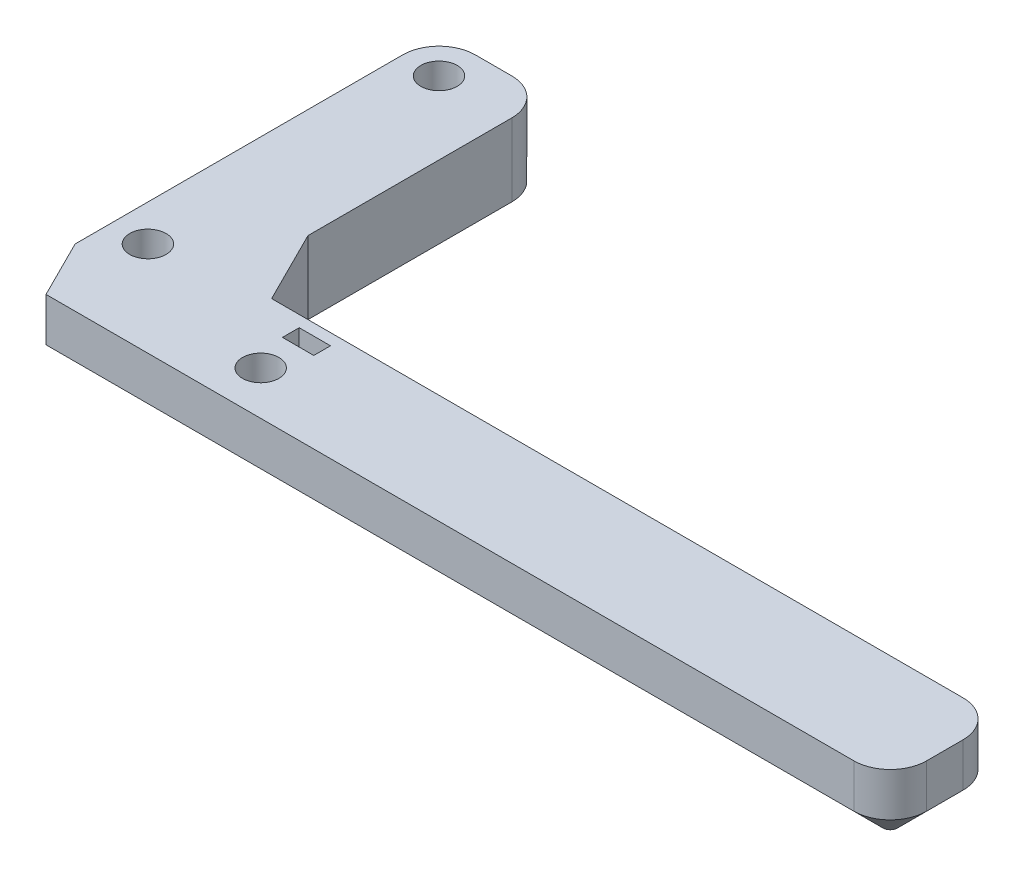
ISO-10303-21;
HEADER;
FILE_DESCRIPTION(('STEP AP214'),'2;1');
FILE_NAME('part.step','',(''),(''),'','','');
FILE_SCHEMA(('AUTOMOTIVE_DESIGN { 1 0 10303 214 1 1 1 1 }'));
ENDSEC;
DATA;
#1=APPLICATION_CONTEXT('core data for automotive mechanical design processes');
#2=APPLICATION_PROTOCOL_DEFINITION('international standard','automotive_design',2000,#1);
#3=PRODUCT_CONTEXT('',#1,'mechanical');
#4=PRODUCT('Part','Part','',(#3));
#5=PRODUCT_RELATED_PRODUCT_CATEGORY('part','',(#4));
#6=PRODUCT_DEFINITION_FORMATION('','',#4);
#7=PRODUCT_DEFINITION_CONTEXT('part definition',#1,'design');
#8=PRODUCT_DEFINITION('design','',#6,#7);
#9=PRODUCT_DEFINITION_SHAPE('','',#8);
#10=(LENGTH_UNIT() NAMED_UNIT(*) SI_UNIT(.MILLI.,.METRE.));
#11=(NAMED_UNIT(*) PLANE_ANGLE_UNIT() SI_UNIT($,.RADIAN.));
#12=(NAMED_UNIT(*) SI_UNIT($,.STERADIAN.) SOLID_ANGLE_UNIT());
#13=UNCERTAINTY_MEASURE_WITH_UNIT(LENGTH_MEASURE(1.E-05),#10,'distance_accuracy_value','');
#14=(GEOMETRIC_REPRESENTATION_CONTEXT(3) GLOBAL_UNCERTAINTY_ASSIGNED_CONTEXT((#13)) GLOBAL_UNIT_ASSIGNED_CONTEXT((#10,
#11,#12)) REPRESENTATION_CONTEXT('',''));
#15=CARTESIAN_POINT('',(0.,0.,0.));
#16=DIRECTION('',(0.,0.,1.));
#17=DIRECTION('',(1.,0.,0.));
#18=AXIS2_PLACEMENT_3D('',#15,#16,#17);
#19=CARTESIAN_POINT('',(0.,0.,0.));
#20=DIRECTION('',(0.,1.,0.));
#21=DIRECTION('',(0.,0.,1.));
#22=AXIS2_PLACEMENT_3D('',#19,#20,#21);
#23=PLANE('',#22);
#24=DIRECTION('',(-1.,0.,0.));
#25=VECTOR('',#24,1.);
#26=CARTESIAN_POINT('',(0.,0.,29.));
#27=LINE('',#26,#25);
#28=CARTESIAN_POINT('',(115.,0.,29.));
#29=VERTEX_POINT('',#28);
#30=CARTESIAN_POINT('',(29.,0.,29.));
#31=VERTEX_POINT('',#30);
#32=EDGE_CURVE('E457',#29,#31,#27,.T.);
#33=ORIENTED_EDGE('',*,*,#32,.T.);
#34=CARTESIAN_POINT('',(27.5,0.,27.));
#35=DIRECTION('',(0.,-1.,0.));
#36=DIRECTION('',(0.,0.,-1.));
#37=AXIS2_PLACEMENT_3D('',#34,#35,#36);
#38=CIRCLE('',#37,2.5);
#39=CARTESIAN_POINT('',(26.,0.,29.));
#40=VERTEX_POINT('',#39);
#41=EDGE_CURVE('E61',#40,#31,#38,.T.);
#42=ORIENTED_EDGE('',*,*,#41,.F.);
#43=CARTESIAN_POINT('',(14.,0.,29.));
#44=VERTEX_POINT('',#43);
#45=EDGE_CURVE('E456',#40,#44,#27,.T.);
#46=ORIENTED_EDGE('',*,*,#45,.T.);
#47=DIRECTION('',(0.,0.,1.));
#48=VECTOR('',#47,1.);
#49=CARTESIAN_POINT('',(14.,0.,-25.));
#50=LINE('',#49,#48);
#51=CARTESIAN_POINT('',(14.,0.,-23.));
#52=VERTEX_POINT('',#51);
#53=EDGE_CURVE('E488',#52,#44,#50,.T.);
#54=ORIENTED_EDGE('',*,*,#53,.F.);
#55=CARTESIAN_POINT('',(9.99999999999999,0.,-20.));
#56=DIRECTION('',(0.,1.,0.));
#57=DIRECTION('',(0.,0.,1.));
#58=AXIS2_PLACEMENT_3D('',#55,#56,#57);
#59=CIRCLE('',#58,5.);
#60=CARTESIAN_POINT('',(15.,0.,-20.));
#61=VERTEX_POINT('',#60);
#62=EDGE_CURVE('E396',#52,#61,#59,.F.);
#63=ORIENTED_EDGE('',*,*,#62,.T.);
#64=DIRECTION('',(0.,0.,-1.));
#65=VECTOR('',#64,1.);
#66=CARTESIAN_POINT('',(15.,0.,-25.));
#67=LINE('',#66,#65);
#68=CARTESIAN_POINT('',(15.,0.,8.));
#69=VERTEX_POINT('',#68);
#70=EDGE_CURVE('E367',#69,#61,#67,.T.);
#71=ORIENTED_EDGE('',*,*,#70,.F.);
#72=DIRECTION('',(-0.447213595499958,0.,-0.894427190999916));
#73=VECTOR('',#72,1.);
#74=CARTESIAN_POINT('',(15.,0.,8.));
#75=LINE('',#74,#73);
#76=CARTESIAN_POINT('',(22.,0.,22.));
#77=VERTEX_POINT('',#76);
#78=EDGE_CURVE('E239',#77,#69,#75,.T.);
#79=ORIENTED_EDGE('',*,*,#78,.F.);
#80=DIRECTION('',(1.,0.,0.));
#81=VECTOR('',#80,1.);
#82=CARTESIAN_POINT('',(0.,0.,22.));
#83=LINE('',#82,#81);
#84=CARTESIAN_POINT('',(115.,0.,22.0000000000001));
#85=VERTEX_POINT('',#84);
#86=EDGE_CURVE('E444',#77,#85,#83,.T.);
#87=ORIENTED_EDGE('',*,*,#86,.T.);
#88=CARTESIAN_POINT('',(115.,0.,23.));
#89=DIRECTION('',(0.,1.,0.));
#90=DIRECTION('',(0.,0.,1.));
#91=AXIS2_PLACEMENT_3D('',#88,#89,#90);
#92=CIRCLE('',#91,0.999999999999973);
#93=CARTESIAN_POINT('',(116.,0.,23.));
#94=VERTEX_POINT('',#93);
#95=EDGE_CURVE('E447',#85,#94,#92,.F.);
#96=ORIENTED_EDGE('',*,*,#95,.T.);
#97=DIRECTION('',(0.,0.,1.));
#98=VECTOR('',#97,1.);
#99=CARTESIAN_POINT('',(116.,0.,0.));
#100=LINE('',#99,#98);
#101=CARTESIAN_POINT('',(116.,0.,28.));
#102=VERTEX_POINT('',#101);
#103=EDGE_CURVE('E450',#94,#102,#100,.T.);
#104=ORIENTED_EDGE('',*,*,#103,.T.);
#105=CARTESIAN_POINT('',(115.,0.,28.));
#106=DIRECTION('',(0.,1.,0.));
#107=DIRECTION('',(0.,0.,1.));
#108=AXIS2_PLACEMENT_3D('',#105,#106,#107);
#109=CIRCLE('',#108,0.99999999999997);
#110=EDGE_CURVE('E453',#102,#29,#109,.F.);
#111=ORIENTED_EDGE('',*,*,#110,.T.);
#112=EDGE_LOOP('',(#33,#42,#46,#54,#63,#71,#79,#87,#96,#104,#111));
#113=FACE_BOUND('',#112,.T.);
#114=ADVANCED_FACE('F46',(#113),#23,.F.);
#115=CARTESIAN_POINT('',(0.,10.,0.));
#116=DIRECTION('',(0.,1.,0.));
#117=DIRECTION('',(0.,0.,1.));
#118=AXIS2_PLACEMENT_3D('',#115,#116,#117);
#119=PLANE('',#118);
#120=CARTESIAN_POINT('',(27.5,10.,27.));
#121=DIRECTION('',(0.,-1.,0.));
#122=DIRECTION('',(0.,0.,-1.));
#123=AXIS2_PLACEMENT_3D('',#120,#121,#122);
#124=CIRCLE('',#123,2.5);
#125=CARTESIAN_POINT('',(27.5,10.,24.5));
#126=VERTEX_POINT('',#125);
#127=EDGE_CURVE('E264',#126,#126,#124,.T.);
#128=ORIENTED_EDGE('',*,*,#127,.T.);
#129=EDGE_LOOP('',(#128));
#130=FACE_BOUND('',#129,.T.);
#131=CARTESIAN_POINT('',(5.,10.,-20.));
#132=DIRECTION('',(0.,1.,0.));
#133=DIRECTION('',(0.,0.,1.));
#134=AXIS2_PLACEMENT_3D('',#131,#132,#133);
#135=CIRCLE('',#134,2.5);
#136=CARTESIAN_POINT('',(5.,10.,-17.5));
#137=VERTEX_POINT('',#136);
#138=EDGE_CURVE('E240',#137,#137,#135,.T.);
#139=ORIENTED_EDGE('',*,*,#138,.F.);
#140=EDGE_LOOP('',(#139));
#141=FACE_BOUND('',#140,.T.);
#142=DIRECTION('',(1.,0.,0.));
#143=VECTOR('',#142,1.);
#144=CARTESIAN_POINT('',(4.,10.,33.));
#145=LINE('',#144,#143);
#146=CARTESIAN_POINT('',(4.,10.,33.));
#147=VERTEX_POINT('',#146);
#148=CARTESIAN_POINT('',(115.,10.,33.));
#149=VERTEX_POINT('',#148);
#150=EDGE_CURVE('E339',#147,#149,#145,.T.);
#151=ORIENTED_EDGE('',*,*,#150,.T.);
#152=CARTESIAN_POINT('',(115.,10.,28.));
#153=DIRECTION('',(0.,1.,0.));
#154=DIRECTION('',(0.,0.,1.));
#155=AXIS2_PLACEMENT_3D('',#152,#153,#154);
#156=CIRCLE('',#155,5.);
#157=CARTESIAN_POINT('',(120.,10.,28.));
#158=VERTEX_POINT('',#157);
#159=EDGE_CURVE('E411',#149,#158,#156,.T.);
#160=ORIENTED_EDGE('',*,*,#159,.T.);
#161=DIRECTION('',(0.,0.,-1.));
#162=VECTOR('',#161,1.);
#163=CARTESIAN_POINT('',(120.,10.,33.));
#164=LINE('',#163,#162);
#165=CARTESIAN_POINT('',(120.,10.,23.));
#166=VERTEX_POINT('',#165);
#167=EDGE_CURVE('E344',#158,#166,#164,.T.);
#168=ORIENTED_EDGE('',*,*,#167,.T.);
#169=CARTESIAN_POINT('',(115.,10.,23.));
#170=DIRECTION('',(0.,1.,0.));
#171=DIRECTION('',(0.,0.,1.));
#172=AXIS2_PLACEMENT_3D('',#169,#170,#171);
#173=CIRCLE('',#172,5.);
#174=CARTESIAN_POINT('',(115.,10.,18.));
#175=VERTEX_POINT('',#174);
#176=EDGE_CURVE('E408',#166,#175,#173,.T.);
#177=ORIENTED_EDGE('',*,*,#176,.T.);
#178=DIRECTION('',(-1.,0.,0.));
#179=VECTOR('',#178,1.);
#180=CARTESIAN_POINT('',(120.,10.,18.));
#181=LINE('',#180,#179);
#182=CARTESIAN_POINT('',(20.,10.,18.));
#183=VERTEX_POINT('',#182);
#184=EDGE_CURVE('E348',#175,#183,#181,.T.);
#185=ORIENTED_EDGE('',*,*,#184,.T.);
#186=DIRECTION('',(-0.447213595499958,0.,-0.894427190999916));
#187=VECTOR('',#186,1.);
#188=CARTESIAN_POINT('',(15.,10.,8.));
#189=LINE('',#188,#187);
#190=CARTESIAN_POINT('',(15.,10.,8.));
#191=VERTEX_POINT('',#190);
#192=EDGE_CURVE('E351',#183,#191,#189,.T.);
#193=ORIENTED_EDGE('',*,*,#192,.T.);
#194=DIRECTION('',(0.,0.,-1.));
#195=VECTOR('',#194,1.);
#196=CARTESIAN_POINT('',(15.,10.,-25.));
#197=LINE('',#196,#195);
#198=CARTESIAN_POINT('',(15.,10.,-20.));
#199=VERTEX_POINT('',#198);
#200=EDGE_CURVE('E354',#191,#199,#197,.T.);
#201=ORIENTED_EDGE('',*,*,#200,.T.);
#202=CARTESIAN_POINT('',(9.99999999999999,10.,-20.));
#203=DIRECTION('',(0.,1.,0.));
#204=DIRECTION('',(0.,0.,1.));
#205=AXIS2_PLACEMENT_3D('',#202,#203,#204);
#206=CIRCLE('',#205,5.);
#207=CARTESIAN_POINT('',(9.99999999999999,10.,-25.));
#208=VERTEX_POINT('',#207);
#209=EDGE_CURVE('E402',#199,#208,#206,.T.);
#210=ORIENTED_EDGE('',*,*,#209,.T.);
#211=DIRECTION('',(-1.,0.,0.));
#212=VECTOR('',#211,1.);
#213=CARTESIAN_POINT('',(0.,10.,-25.));
#214=LINE('',#213,#212);
#215=CARTESIAN_POINT('',(4.99999999999999,10.,-25.));
#216=VERTEX_POINT('',#215);
#217=EDGE_CURVE('E358',#208,#216,#214,.T.);
#218=ORIENTED_EDGE('',*,*,#217,.T.);
#219=CARTESIAN_POINT('',(4.99999999999999,10.,-20.));
#220=DIRECTION('',(0.,1.,0.));
#221=DIRECTION('',(0.,0.,1.));
#222=AXIS2_PLACEMENT_3D('',#219,#220,#221);
#223=CIRCLE('',#222,5.);
#224=CARTESIAN_POINT('',(0.,10.,-20.));
#225=VERTEX_POINT('',#224);
#226=EDGE_CURVE('E405',#216,#225,#223,.T.);
#227=ORIENTED_EDGE('',*,*,#226,.T.);
#228=DIRECTION('',(0.,0.,1.));
#229=VECTOR('',#228,1.);
#230=CARTESIAN_POINT('',(0.,10.,25.));
#231=LINE('',#230,#229);
#232=CARTESIAN_POINT('',(0.,10.,25.));
#233=VERTEX_POINT('',#232);
#234=EDGE_CURVE('E362',#225,#233,#231,.T.);
#235=ORIENTED_EDGE('',*,*,#234,.T.);
#236=DIRECTION('',(0.447213595499958,0.,0.894427190999916));
#237=VECTOR('',#236,1.);
#238=CARTESIAN_POINT('',(0.,10.,25.));
#239=LINE('',#238,#237);
#240=EDGE_CURVE('E335',#233,#147,#239,.T.);
#241=ORIENTED_EDGE('',*,*,#240,.T.);
#242=EDGE_LOOP('',(#151,#160,#168,#177,#185,#193,#201,#210,#218,#227,#235,#241));
#243=FACE_BOUND('',#242,.T.);
#244=CARTESIAN_POINT('',(5.00000000000001,10.,20.));
#245=DIRECTION('',(0.,1.,0.));
#246=DIRECTION('',(0.,0.,1.));
#247=AXIS2_PLACEMENT_3D('',#244,#245,#246);
#248=CIRCLE('',#247,2.5);
#249=CARTESIAN_POINT('',(5.00000000000001,10.,22.5));
#250=VERTEX_POINT('',#249);
#251=EDGE_CURVE('E321',#250,#250,#248,.T.);
#252=ORIENTED_EDGE('',*,*,#251,.F.);
#253=EDGE_LOOP('',(#252));
#254=FACE_BOUND('',#253,.T.);
#255=DIRECTION('',(-1.,0.,0.));
#256=VECTOR('',#255,1.);
#257=CARTESIAN_POINT('',(29.66,10.,19.57));
#258=LINE('',#257,#256);
#259=CARTESIAN_POINT('',(29.66,10.,19.57));
#260=VERTEX_POINT('',#259);
#261=CARTESIAN_POINT('',(25.36,10.,19.57));
#262=VERTEX_POINT('',#261);
#263=EDGE_CURVE('E499',#260,#262,#258,.T.);
#264=ORIENTED_EDGE('',*,*,#263,.F.);
#265=DIRECTION('',(0.,0.,-1.));
#266=VECTOR('',#265,1.);
#267=CARTESIAN_POINT('',(29.66,10.,21.87));
#268=LINE('',#267,#266);
#269=CARTESIAN_POINT('',(29.66,10.,21.87));
#270=VERTEX_POINT('',#269);
#271=EDGE_CURVE('E285',#270,#260,#268,.T.);
#272=ORIENTED_EDGE('',*,*,#271,.F.);
#273=DIRECTION('',(1.,0.,0.));
#274=VECTOR('',#273,1.);
#275=CARTESIAN_POINT('',(25.36,10.,21.87));
#276=LINE('',#275,#274);
#277=CARTESIAN_POINT('',(25.36,10.,21.87));
#278=VERTEX_POINT('',#277);
#279=EDGE_CURVE('E304',#278,#270,#276,.T.);
#280=ORIENTED_EDGE('',*,*,#279,.F.);
#281=DIRECTION('',(0.,0.,1.));
#282=VECTOR('',#281,1.);
#283=CARTESIAN_POINT('',(25.36,10.,19.57));
#284=LINE('',#283,#282);
#285=EDGE_CURVE('E312',#262,#278,#284,.T.);
#286=ORIENTED_EDGE('',*,*,#285,.F.);
#287=EDGE_LOOP('',(#264,#272,#280,#286));
#288=FACE_BOUND('',#287,.T.);
#289=ADVANCED_FACE('F509',(#130,#141,#243,#254,#288),#119,.T.);
#290=CARTESIAN_POINT('',(5.00000000000001,0.,20.));
#291=DIRECTION('',(0.,1.,0.));
#292=DIRECTION('',(0.,0.,1.));
#293=AXIS2_PLACEMENT_3D('',#290,#291,#292);
#294=CIRCLE('',#293,2.5);
#295=CARTESIAN_POINT('',(5.00000000000001,0.,22.5));
#296=VERTEX_POINT('',#295);
#297=EDGE_CURVE('E320',#296,#296,#294,.T.);
#298=ORIENTED_EDGE('',*,*,#297,.T.);
#299=EDGE_LOOP('',(#298));
#300=FACE_BOUND('',#299,.T.);
#301=CARTESIAN_POINT('',(5.,0.,-20.));
#302=DIRECTION('',(0.,1.,0.));
#303=DIRECTION('',(0.,0.,1.));
#304=AXIS2_PLACEMENT_3D('',#301,#302,#303);
#305=CIRCLE('',#304,2.5);
#306=CARTESIAN_POINT('',(5.,0.,-17.5));
#307=VERTEX_POINT('',#306);
#308=EDGE_CURVE('E325',#307,#307,#305,.T.);
#309=ORIENTED_EDGE('',*,*,#308,.T.);
#310=EDGE_LOOP('',(#309));
#311=FACE_BOUND('',#310,.T.);
#312=DIRECTION('',(0.,0.,-1.));
#313=VECTOR('',#312,1.);
#314=CARTESIAN_POINT('',(9.99999999999999,0.,34.3956784204101));
#315=LINE('',#314,#313);
#316=CARTESIAN_POINT('',(9.99999999999999,0.,29.));
#317=VERTEX_POINT('',#316);
#318=CARTESIAN_POINT('',(10.,0.,-25.));
#319=VERTEX_POINT('',#318);
#320=EDGE_CURVE('E103',#317,#319,#315,.T.);
#321=ORIENTED_EDGE('',*,*,#320,.F.);
#322=DIRECTION('',(1.,0.,0.));
#323=VECTOR('',#322,1.);
#324=CARTESIAN_POINT('',(4.,0.,29.));
#325=LINE('',#324,#323);
#326=CARTESIAN_POINT('',(1.99999999999999,0.,29.));
#327=VERTEX_POINT('',#326);
#328=EDGE_CURVE('E217',#317,#327,#325,.F.);
#329=ORIENTED_EDGE('',*,*,#328,.T.);
#330=DIRECTION('',(0.447213595499958,0.,0.894427190999916));
#331=VECTOR('',#330,1.);
#332=CARTESIAN_POINT('',(0.,0.,25.));
#333=LINE('',#332,#331);
#334=CARTESIAN_POINT('',(0.,0.,25.));
#335=VERTEX_POINT('',#334);
#336=EDGE_CURVE('E221',#335,#327,#333,.T.);
#337=ORIENTED_EDGE('',*,*,#336,.F.);
#338=DIRECTION('',(0.,0.,1.));
#339=VECTOR('',#338,1.);
#340=CARTESIAN_POINT('',(0.,0.,25.));
#341=LINE('',#340,#339);
#342=CARTESIAN_POINT('',(0.,0.,-20.));
#343=VERTEX_POINT('',#342);
#344=EDGE_CURVE('E340',#343,#335,#341,.T.);
#345=ORIENTED_EDGE('',*,*,#344,.F.);
#346=CARTESIAN_POINT('',(4.99999999999999,0.,-20.));
#347=DIRECTION('',(0.,1.,0.));
#348=DIRECTION('',(0.,0.,1.));
#349=AXIS2_PLACEMENT_3D('',#346,#347,#348);
#350=CIRCLE('',#349,5.);
#351=CARTESIAN_POINT('',(4.99999999999999,0.,-25.));
#352=VERTEX_POINT('',#351);
#353=EDGE_CURVE('E421',#343,#352,#350,.F.);
#354=ORIENTED_EDGE('',*,*,#353,.T.);
#355=DIRECTION('',(-1.,0.,0.));
#356=VECTOR('',#355,1.);
#357=CARTESIAN_POINT('',(0.,0.,-25.));
#358=LINE('',#357,#356);
#359=EDGE_CURVE('E371',#319,#352,#358,.T.);
#360=ORIENTED_EDGE('',*,*,#359,.F.);
#361=EDGE_LOOP('',(#321,#329,#337,#345,#354,#360));
#362=FACE_BOUND('',#361,.T.);
#363=ADVANCED_FACE('F219',(#300,#311,#362),#23,.F.);
#364=CARTESIAN_POINT('',(0.,10.,25.));
#365=DIRECTION('',(0.894427190999916,0.,-0.447213595499958));
#366=DIRECTION('',(-0.447213595499958,0.,-0.894427190999916));
#367=AXIS2_PLACEMENT_3D('',#364,#365,#366);
#368=PLANE('',#367);
#369=ORIENTED_EDGE('',*,*,#336,.T.);
#370=DIRECTION('',(-0.333333333333334,-0.666666666666665,-0.666666666666668));
#371=VECTOR('',#370,1.);
#372=CARTESIAN_POINT('',(4.,4.00000000000002,33.));
#373=LINE('',#372,#371);
#374=CARTESIAN_POINT('',(4.,4.00000000000002,33.));
#375=VERTEX_POINT('',#374);
#376=EDGE_CURVE('E227',#327,#375,#373,.F.);
#377=ORIENTED_EDGE('',*,*,#376,.T.);
#378=DIRECTION('',(0.,-1.,0.));
#379=VECTOR('',#378,1.);
#380=CARTESIAN_POINT('',(4.,10.,33.));
#381=LINE('',#380,#379);
#382=EDGE_CURVE('E386',#147,#375,#381,.T.);
#383=ORIENTED_EDGE('',*,*,#382,.F.);
#384=ORIENTED_EDGE('',*,*,#240,.F.);
#385=DIRECTION('',(0.,-1.,0.));
#386=VECTOR('',#385,1.);
#387=CARTESIAN_POINT('',(0.,10.,25.));
#388=LINE('',#387,#386);
#389=EDGE_CURVE('E237',#233,#335,#388,.T.);
#390=ORIENTED_EDGE('',*,*,#389,.T.);
#391=EDGE_LOOP('',(#369,#377,#383,#384,#390));
#392=FACE_BOUND('',#391,.T.);
#393=ADVANCED_FACE('F232',(#392),#368,.F.);
#394=CARTESIAN_POINT('',(4.,10.,33.));
#395=DIRECTION('',(0.,0.,-1.));
#396=DIRECTION('',(-1.,0.,0.));
#397=AXIS2_PLACEMENT_3D('',#394,#395,#396);
#398=PLANE('',#397);
#399=ORIENTED_EDGE('',*,*,#382,.T.);
#400=DIRECTION('',(1.,0.,0.));
#401=VECTOR('',#400,1.);
#402=CARTESIAN_POINT('',(4.,4.00000000000002,33.));
#403=LINE('',#402,#401);
#404=CARTESIAN_POINT('',(115.,4.00000000000002,33.));
#405=VERTEX_POINT('',#404);
#406=EDGE_CURVE('E244',#375,#405,#403,.T.);
#407=ORIENTED_EDGE('',*,*,#406,.T.);
#408=DIRECTION('',(0.,-1.,0.));
#409=VECTOR('',#408,1.);
#410=CARTESIAN_POINT('',(115.,10.,33.));
#411=LINE('',#410,#409);
#412=EDGE_CURVE('E399',#405,#149,#411,.F.);
#413=ORIENTED_EDGE('',*,*,#412,.T.);
#414=ORIENTED_EDGE('',*,*,#150,.F.);
#415=EDGE_LOOP('',(#399,#407,#413,#414));
#416=FACE_BOUND('',#415,.T.);
#417=ADVANCED_FACE('F536',(#416),#398,.F.);
#418=CARTESIAN_POINT('',(120.,10.,33.));
#419=DIRECTION('',(-1.,0.,0.));
#420=DIRECTION('',(0.,0.,1.));
#421=AXIS2_PLACEMENT_3D('',#418,#419,#420);
#422=PLANE('',#421);
#423=DIRECTION('',(0.,-1.,0.));
#424=VECTOR('',#423,1.);
#425=CARTESIAN_POINT('',(120.,10.,28.));
#426=LINE('',#425,#424);
#427=CARTESIAN_POINT('',(120.,4.00000000000002,28.));
#428=VERTEX_POINT('',#427);
#429=EDGE_CURVE('E392',#158,#428,#426,.T.);
#430=ORIENTED_EDGE('',*,*,#429,.T.);
#431=DIRECTION('',(0.,0.,-1.));
#432=VECTOR('',#431,1.);
#433=CARTESIAN_POINT('',(120.,4.00000000000002,33.));
#434=LINE('',#433,#432);
#435=CARTESIAN_POINT('',(120.,4.00000000000002,23.));
#436=VERTEX_POINT('',#435);
#437=EDGE_CURVE('E440',#428,#436,#434,.T.);
#438=ORIENTED_EDGE('',*,*,#437,.T.);
#439=DIRECTION('',(0.,-1.,0.));
#440=VECTOR('',#439,1.);
#441=CARTESIAN_POINT('',(120.,10.,23.));
#442=LINE('',#441,#440);
#443=EDGE_CURVE('E389',#436,#166,#442,.F.);
#444=ORIENTED_EDGE('',*,*,#443,.T.);
#445=ORIENTED_EDGE('',*,*,#167,.F.);
#446=EDGE_LOOP('',(#430,#438,#444,#445));
#447=FACE_BOUND('',#446,.T.);
#448=ADVANCED_FACE('F571',(#447),#422,.F.);
#449=CARTESIAN_POINT('',(20.,10.,18.));
#450=DIRECTION('',(0.,0.,1.));
#451=DIRECTION('',(1.,0.,0.));
#452=AXIS2_PLACEMENT_3D('',#449,#450,#451);
#453=PLANE('',#452);
#454=DIRECTION('',(0.,-1.,0.));
#455=VECTOR('',#454,1.);
#456=CARTESIAN_POINT('',(115.,10.,18.));
#457=LINE('',#456,#455);
#458=CARTESIAN_POINT('',(115.,4.00000000000002,18.));
#459=VERTEX_POINT('',#458);
#460=EDGE_CURVE('E414',#175,#459,#457,.T.);
#461=ORIENTED_EDGE('',*,*,#460,.T.);
#462=DIRECTION('',(-1.,0.,0.));
#463=VECTOR('',#462,1.);
#464=CARTESIAN_POINT('',(20.,4.00000000000002,18.));
#465=LINE('',#464,#463);
#466=CARTESIAN_POINT('',(20.,4.00000000000002,18.));
#467=VERTEX_POINT('',#466);
#468=EDGE_CURVE('E70',#459,#467,#465,.T.);
#469=ORIENTED_EDGE('',*,*,#468,.T.);
#470=DIRECTION('',(0.,-1.,0.));
#471=VECTOR('',#470,1.);
#472=CARTESIAN_POINT('',(20.,10.,18.));
#473=LINE('',#472,#471);
#474=EDGE_CURVE('E383',#183,#467,#473,.T.);
#475=ORIENTED_EDGE('',*,*,#474,.F.);
#476=ORIENTED_EDGE('',*,*,#184,.F.);
#477=EDGE_LOOP('',(#461,#469,#475,#476));
#478=FACE_BOUND('',#477,.T.);
#479=ADVANCED_FACE('F591',(#478),#453,.F.);
#480=CARTESIAN_POINT('',(15.,10.,8.));
#481=DIRECTION('',(-0.894427190999916,0.,0.447213595499958));
#482=DIRECTION('',(0.447213595499958,0.,0.894427190999916));
#483=AXIS2_PLACEMENT_3D('',#480,#481,#482);
#484=PLANE('',#483);
#485=ORIENTED_EDGE('',*,*,#78,.T.);
#486=DIRECTION('',(0.,-1.,0.));
#487=VECTOR('',#486,1.);
#488=CARTESIAN_POINT('',(15.,10.,8.));
#489=LINE('',#488,#487);
#490=EDGE_CURVE('E379',#191,#69,#489,.T.);
#491=ORIENTED_EDGE('',*,*,#490,.F.);
#492=ORIENTED_EDGE('',*,*,#192,.F.);
#493=ORIENTED_EDGE('',*,*,#474,.T.);
#494=DIRECTION('',(-0.333333333333334,0.666666666666665,-0.666666666666668));
#495=VECTOR('',#494,1.);
#496=CARTESIAN_POINT('',(15.8888888888889,12.2222222222222,9.77777777777777));
#497=LINE('',#496,#495);
#498=EDGE_CURVE('E56',#467,#77,#497,.F.);
#499=ORIENTED_EDGE('',*,*,#498,.T.);
#500=EDGE_LOOP('',(#485,#491,#492,#493,#499));
#501=FACE_BOUND('',#500,.T.);
#502=ADVANCED_FACE('F596',(#501),#484,.F.);
#503=CARTESIAN_POINT('',(15.,10.,-25.));
#504=DIRECTION('',(-1.,0.,0.));
#505=DIRECTION('',(0.,0.,1.));
#506=AXIS2_PLACEMENT_3D('',#503,#504,#505);
#507=PLANE('',#506);
#508=ORIENTED_EDGE('',*,*,#70,.T.);
#509=DIRECTION('',(0.,-1.,0.));
#510=VECTOR('',#509,1.);
#511=CARTESIAN_POINT('',(15.,10.,-20.));
#512=LINE('',#511,#510);
#513=EDGE_CURVE('E437',#61,#199,#512,.F.);
#514=ORIENTED_EDGE('',*,*,#513,.T.);
#515=ORIENTED_EDGE('',*,*,#200,.F.);
#516=ORIENTED_EDGE('',*,*,#490,.T.);
#517=EDGE_LOOP('',(#508,#514,#515,#516));
#518=FACE_BOUND('',#517,.T.);
#519=ADVANCED_FACE('F775',(#518),#507,.F.);
#520=CARTESIAN_POINT('',(0.,10.,-25.));
#521=DIRECTION('',(0.,0.,1.));
#522=DIRECTION('',(1.,0.,0.));
#523=AXIS2_PLACEMENT_3D('',#520,#521,#522);
#524=PLANE('',#523);
#525=ORIENTED_EDGE('',*,*,#359,.T.);
#526=DIRECTION('',(0.,-1.,0.));
#527=VECTOR('',#526,1.);
#528=CARTESIAN_POINT('',(4.99999999999999,10.,-25.));
#529=LINE('',#528,#527);
#530=EDGE_CURVE('E428',#352,#216,#529,.F.);
#531=ORIENTED_EDGE('',*,*,#530,.T.);
#532=ORIENTED_EDGE('',*,*,#217,.F.);
#533=DIRECTION('',(0.,-1.,0.));
#534=VECTOR('',#533,1.);
#535=CARTESIAN_POINT('',(9.99999999999999,10.,-25.));
#536=LINE('',#535,#534);
#537=CARTESIAN_POINT('',(9.99999999999999,3.,-25.));
#538=VERTEX_POINT('',#537);
#539=EDGE_CURVE('E424',#208,#538,#536,.T.);
#540=ORIENTED_EDGE('',*,*,#539,.T.);
#541=DIRECTION('',(0.,-1.,0.));
#542=VECTOR('',#541,1.);
#543=CARTESIAN_POINT('',(10.,3.,-25.));
#544=LINE('',#543,#542);
#545=EDGE_CURVE('E280',#538,#319,#544,.T.);
#546=ORIENTED_EDGE('',*,*,#545,.T.);
#547=EDGE_LOOP('',(#525,#531,#532,#540,#546));
#548=FACE_BOUND('',#547,.T.);
#549=ADVANCED_FACE('F553',(#548),#524,.F.);
#550=CARTESIAN_POINT('',(0.,10.,25.));
#551=DIRECTION('',(1.,0.,0.));
#552=DIRECTION('',(0.,0.,-1.));
#553=AXIS2_PLACEMENT_3D('',#550,#551,#552);
#554=PLANE('',#553);
#555=ORIENTED_EDGE('',*,*,#234,.F.);
#556=DIRECTION('',(0.,-1.,0.));
#557=VECTOR('',#556,1.);
#558=CARTESIAN_POINT('',(0.,10.,-20.));
#559=LINE('',#558,#557);
#560=EDGE_CURVE('E417',#225,#343,#559,.T.);
#561=ORIENTED_EDGE('',*,*,#560,.T.);
#562=ORIENTED_EDGE('',*,*,#344,.T.);
#563=ORIENTED_EDGE('',*,*,#389,.F.);
#564=EDGE_LOOP('',(#555,#561,#562,#563));
#565=FACE_BOUND('',#564,.T.);
#566=ADVANCED_FACE('F544',(#565),#554,.F.);
#567=CARTESIAN_POINT('',(5.,10.,-20.));
#568=DIRECTION('',(0.,-1.,0.));
#569=DIRECTION('',(0.,0.,-1.));
#570=AXIS2_PLACEMENT_3D('',#567,#568,#569);
#571=CYLINDRICAL_SURFACE('',#570,2.5);
#572=ORIENTED_EDGE('',*,*,#138,.T.);
#573=EDGE_LOOP('',(#572));
#574=FACE_BOUND('',#573,.T.);
#575=ORIENTED_EDGE('',*,*,#308,.F.);
#576=EDGE_LOOP('',(#575));
#577=FACE_BOUND('',#576,.T.);
#578=ADVANCED_FACE('F542',(#574,#577),#571,.F.);
#579=CARTESIAN_POINT('',(5.00000000000001,10.,20.));
#580=DIRECTION('',(0.,-1.,0.));
#581=DIRECTION('',(0.,0.,-1.));
#582=AXIS2_PLACEMENT_3D('',#579,#580,#581);
#583=CYLINDRICAL_SURFACE('',#582,2.5);
#584=ORIENTED_EDGE('',*,*,#251,.T.);
#585=EDGE_LOOP('',(#584));
#586=FACE_BOUND('',#585,.T.);
#587=ORIENTED_EDGE('',*,*,#297,.F.);
#588=EDGE_LOOP('',(#587));
#589=FACE_BOUND('',#588,.T.);
#590=ADVANCED_FACE('F518',(#586,#589),#583,.F.);
#591=CARTESIAN_POINT('',(29.66,10.,21.87));
#592=DIRECTION('',(-1.,0.,0.));
#593=DIRECTION('',(0.,0.,1.));
#594=AXIS2_PLACEMENT_3D('',#591,#592,#593);
#595=PLANE('',#594);
#596=DIRECTION('',(0.,-0.707106781186546,0.707106781186549));
#597=VECTOR('',#596,1.);
#598=CARTESIAN_POINT('',(29.66,4.00000000000002,18.));
#599=LINE('',#598,#597);
#600=CARTESIAN_POINT('',(29.66,0.130000000000026,21.87));
#601=VERTEX_POINT('',#600);
#602=CARTESIAN_POINT('',(29.66,2.43000000000002,19.57));
#603=VERTEX_POINT('',#602);
#604=EDGE_CURVE('E276',#601,#603,#599,.F.);
#605=ORIENTED_EDGE('',*,*,#604,.F.);
#606=DIRECTION('',(0.,-1.,0.));
#607=VECTOR('',#606,1.);
#608=CARTESIAN_POINT('',(29.66,10.,21.87));
#609=LINE('',#608,#607);
#610=EDGE_CURVE('E298',#270,#601,#609,.T.);
#611=ORIENTED_EDGE('',*,*,#610,.F.);
#612=ORIENTED_EDGE('',*,*,#271,.T.);
#613=DIRECTION('',(0.,-1.,0.));
#614=VECTOR('',#613,1.);
#615=CARTESIAN_POINT('',(29.66,10.,19.57));
#616=LINE('',#615,#614);
#617=EDGE_CURVE('E300',#260,#603,#616,.T.);
#618=ORIENTED_EDGE('',*,*,#617,.T.);
#619=EDGE_LOOP('',(#605,#611,#612,#618));
#620=FACE_BOUND('',#619,.T.);
#621=ADVANCED_FACE('F297',(#620),#595,.T.);
#622=CARTESIAN_POINT('',(29.66,10.,19.57));
#623=DIRECTION('',(0.,0.,1.));
#624=DIRECTION('',(1.,0.,0.));
#625=AXIS2_PLACEMENT_3D('',#622,#623,#624);
#626=PLANE('',#625);
#627=DIRECTION('',(1.,0.,0.));
#628=VECTOR('',#627,1.);
#629=CARTESIAN_POINT('',(20.,2.43000000000002,19.57));
#630=LINE('',#629,#628);
#631=CARTESIAN_POINT('',(25.36,2.43000000000002,19.57));
#632=VERTEX_POINT('',#631);
#633=EDGE_CURVE('E94',#603,#632,#630,.F.);
#634=ORIENTED_EDGE('',*,*,#633,.F.);
#635=ORIENTED_EDGE('',*,*,#617,.F.);
#636=ORIENTED_EDGE('',*,*,#263,.T.);
#637=DIRECTION('',(0.,-1.,0.));
#638=VECTOR('',#637,1.);
#639=CARTESIAN_POINT('',(25.36,10.,19.57));
#640=LINE('',#639,#638);
#641=EDGE_CURVE('E310',#262,#632,#640,.T.);
#642=ORIENTED_EDGE('',*,*,#641,.T.);
#643=EDGE_LOOP('',(#634,#635,#636,#642));
#644=FACE_BOUND('',#643,.T.);
#645=ADVANCED_FACE('F510',(#644),#626,.T.);
#646=CARTESIAN_POINT('',(25.36,10.,19.57));
#647=DIRECTION('',(1.,0.,0.));
#648=DIRECTION('',(0.,0.,-1.));
#649=AXIS2_PLACEMENT_3D('',#646,#647,#648);
#650=PLANE('',#649);
#651=DIRECTION('',(0.,0.707106781186546,-0.707106781186549));
#652=VECTOR('',#651,1.);
#653=CARTESIAN_POINT('',(25.36,4.00000000000002,18.));
#654=LINE('',#653,#652);
#655=CARTESIAN_POINT('',(25.36,0.130000000000026,21.87));
#656=VERTEX_POINT('',#655);
#657=EDGE_CURVE('E286',#632,#656,#654,.F.);
#658=ORIENTED_EDGE('',*,*,#657,.F.);
#659=ORIENTED_EDGE('',*,*,#641,.F.);
#660=ORIENTED_EDGE('',*,*,#285,.T.);
#661=DIRECTION('',(0.,-1.,0.));
#662=VECTOR('',#661,1.);
#663=CARTESIAN_POINT('',(25.36,10.,21.87));
#664=LINE('',#663,#662);
#665=EDGE_CURVE('E306',#278,#656,#664,.T.);
#666=ORIENTED_EDGE('',*,*,#665,.T.);
#667=EDGE_LOOP('',(#658,#659,#660,#666));
#668=FACE_BOUND('',#667,.T.);
#669=ADVANCED_FACE('F506',(#668),#650,.T.);
#670=CARTESIAN_POINT('',(25.36,10.,21.87));
#671=DIRECTION('',(0.,0.,-1.));
#672=DIRECTION('',(-1.,0.,0.));
#673=AXIS2_PLACEMENT_3D('',#670,#671,#672);
#674=PLANE('',#673);
#675=DIRECTION('',(-1.,0.,0.));
#676=VECTOR('',#675,1.);
#677=CARTESIAN_POINT('',(20.,0.130000000000024,21.87));
#678=LINE('',#677,#676);
#679=EDGE_CURVE('E281',#656,#601,#678,.F.);
#680=ORIENTED_EDGE('',*,*,#679,.F.);
#681=ORIENTED_EDGE('',*,*,#665,.F.);
#682=ORIENTED_EDGE('',*,*,#279,.T.);
#683=ORIENTED_EDGE('',*,*,#610,.T.);
#684=EDGE_LOOP('',(#680,#681,#682,#683));
#685=FACE_BOUND('',#684,.T.);
#686=ADVANCED_FACE('F302',(#685),#674,.T.);
#687=CARTESIAN_POINT('',(14.,3.,-25.));
#688=DIRECTION('',(1.,0.,0.));
#689=DIRECTION('',(0.,0.,-1.));
#690=AXIS2_PLACEMENT_3D('',#687,#688,#689);
#691=PLANE('',#690);
#692=ORIENTED_EDGE('',*,*,#53,.T.);
#693=DIRECTION('',(0.,-0.707106781186546,-0.707106781186549));
#694=VECTOR('',#693,1.);
#695=CARTESIAN_POINT('',(14.,4.00000000000002,33.));
#696=LINE('',#695,#694);
#697=CARTESIAN_POINT('',(14.,3.,32.));
#698=VERTEX_POINT('',#697);
#699=EDGE_CURVE('E463',#44,#698,#696,.F.);
#700=ORIENTED_EDGE('',*,*,#699,.T.);
#701=DIRECTION('',(0.,0.,1.));
#702=VECTOR('',#701,1.);
#703=CARTESIAN_POINT('',(14.,3.,-25.));
#704=LINE('',#703,#702);
#705=CARTESIAN_POINT('',(14.,3.,-23.));
#706=VERTEX_POINT('',#705);
#707=EDGE_CURVE('E480',#706,#698,#704,.T.);
#708=ORIENTED_EDGE('',*,*,#707,.F.);
#709=DIRECTION('',(0.,-1.,0.));
#710=VECTOR('',#709,1.);
#711=CARTESIAN_POINT('',(14.,3.,-23.));
#712=LINE('',#711,#710);
#713=EDGE_CURVE('E434',#706,#52,#712,.T.);
#714=ORIENTED_EDGE('',*,*,#713,.T.);
#715=EDGE_LOOP('',(#692,#700,#708,#714));
#716=FACE_BOUND('',#715,.T.);
#717=ADVANCED_FACE('F721',(#716),#691,.F.);
#718=CARTESIAN_POINT('',(9.99999999999999,3.,34.3956784204101));
#719=DIRECTION('',(-1.,0.,0.));
#720=DIRECTION('',(0.,0.,1.));
#721=AXIS2_PLACEMENT_3D('',#718,#719,#720);
#722=PLANE('',#721);
#723=DIRECTION('',(0.,0.,-1.));
#724=VECTOR('',#723,1.);
#725=CARTESIAN_POINT('',(9.99999999999999,3.,34.3956784204101));
#726=LINE('',#725,#724);
#727=CARTESIAN_POINT('',(9.99999999999999,3.,32.));
#728=VERTEX_POINT('',#727);
#729=EDGE_CURVE('E471',#728,#538,#726,.T.);
#730=ORIENTED_EDGE('',*,*,#729,.F.);
#731=DIRECTION('',(0.,0.707106781186546,0.707106781186549));
#732=VECTOR('',#731,1.);
#733=CARTESIAN_POINT('',(9.99999999999999,4.00000000000002,33.));
#734=LINE('',#733,#732);
#735=EDGE_CURVE('E228',#728,#317,#734,.F.);
#736=ORIENTED_EDGE('',*,*,#735,.T.);
#737=ORIENTED_EDGE('',*,*,#320,.T.);
#738=ORIENTED_EDGE('',*,*,#545,.F.);
#739=EDGE_LOOP('',(#730,#736,#737,#738));
#740=FACE_BOUND('',#739,.T.);
#741=ADVANCED_FACE('F470',(#740),#722,.F.);
#742=CARTESIAN_POINT('',(0.,3.,0.));
#743=DIRECTION('',(0.,-1.,0.));
#744=DIRECTION('',(0.,0.,-1.));
#745=AXIS2_PLACEMENT_3D('',#742,#743,#744);
#746=PLANE('',#745);
#747=ORIENTED_EDGE('',*,*,#707,.T.);
#748=DIRECTION('',(1.,0.,0.));
#749=VECTOR('',#748,1.);
#750=CARTESIAN_POINT('',(0.,3.,32.));
#751=LINE('',#750,#749);
#752=EDGE_CURVE('E466',#698,#728,#751,.F.);
#753=ORIENTED_EDGE('',*,*,#752,.T.);
#754=ORIENTED_EDGE('',*,*,#729,.T.);
#755=CARTESIAN_POINT('',(9.99999999999999,3.,-20.));
#756=DIRECTION('',(0.,-1.,0.));
#757=DIRECTION('',(0.,0.,-1.));
#758=AXIS2_PLACEMENT_3D('',#755,#756,#757);
#759=CIRCLE('',#758,5.);
#760=EDGE_CURVE('E431',#538,#706,#759,.T.);
#761=ORIENTED_EDGE('',*,*,#760,.T.);
#762=EDGE_LOOP('',(#747,#753,#754,#761));
#763=FACE_BOUND('',#762,.T.);
#764=ADVANCED_FACE('F477',(#763),#746,.T.);
#765=CARTESIAN_POINT('',(115.,10.,28.));
#766=DIRECTION('',(0.,-1.,0.));
#767=DIRECTION('',(0.,0.,-1.));
#768=AXIS2_PLACEMENT_3D('',#765,#766,#767);
#769=CYLINDRICAL_SURFACE('',#768,5.);
#770=ORIENTED_EDGE('',*,*,#412,.F.);
#771=CARTESIAN_POINT('',(115.,4.00000000000002,28.));
#772=DIRECTION('',(0.,1.,0.));
#773=DIRECTION('',(0.,0.,1.));
#774=AXIS2_PLACEMENT_3D('',#771,#772,#773);
#775=CIRCLE('',#774,5.);
#776=EDGE_CURVE('E246',#405,#428,#775,.T.);
#777=ORIENTED_EDGE('',*,*,#776,.T.);
#778=ORIENTED_EDGE('',*,*,#429,.F.);
#779=ORIENTED_EDGE('',*,*,#159,.F.);
#780=EDGE_LOOP('',(#770,#777,#778,#779));
#781=FACE_BOUND('',#780,.T.);
#782=ADVANCED_FACE('F567',(#781),#769,.T.);
#783=CARTESIAN_POINT('',(115.,10.,23.));
#784=DIRECTION('',(0.,-1.,0.));
#785=DIRECTION('',(0.,0.,-1.));
#786=AXIS2_PLACEMENT_3D('',#783,#784,#785);
#787=CYLINDRICAL_SURFACE('',#786,5.);
#788=ORIENTED_EDGE('',*,*,#443,.F.);
#789=CARTESIAN_POINT('',(115.,4.00000000000002,23.));
#790=DIRECTION('',(0.,1.,0.));
#791=DIRECTION('',(0.,0.,1.));
#792=AXIS2_PLACEMENT_3D('',#789,#790,#791);
#793=CIRCLE('',#792,5.);
#794=EDGE_CURVE('E249',#436,#459,#793,.T.);
#795=ORIENTED_EDGE('',*,*,#794,.T.);
#796=ORIENTED_EDGE('',*,*,#460,.F.);
#797=ORIENTED_EDGE('',*,*,#176,.F.);
#798=EDGE_LOOP('',(#788,#795,#796,#797));
#799=FACE_BOUND('',#798,.T.);
#800=ADVANCED_FACE('F588',(#799),#787,.T.);
#801=CARTESIAN_POINT('',(4.99999999999999,10.,-20.));
#802=DIRECTION('',(0.,-1.,0.));
#803=DIRECTION('',(0.,0.,-1.));
#804=AXIS2_PLACEMENT_3D('',#801,#802,#803);
#805=CYLINDRICAL_SURFACE('',#804,5.);
#806=ORIENTED_EDGE('',*,*,#226,.F.);
#807=ORIENTED_EDGE('',*,*,#530,.F.);
#808=ORIENTED_EDGE('',*,*,#353,.F.);
#809=ORIENTED_EDGE('',*,*,#560,.F.);
#810=EDGE_LOOP('',(#806,#807,#808,#809));
#811=FACE_BOUND('',#810,.T.);
#812=ADVANCED_FACE('F614',(#811),#805,.T.);
#813=CARTESIAN_POINT('',(9.99999999999999,10.,-20.));
#814=DIRECTION('',(0.,-1.,0.));
#815=DIRECTION('',(0.,0.,-1.));
#816=AXIS2_PLACEMENT_3D('',#813,#814,#815);
#817=CYLINDRICAL_SURFACE('',#816,5.);
#818=ORIENTED_EDGE('',*,*,#209,.F.);
#819=ORIENTED_EDGE('',*,*,#513,.F.);
#820=ORIENTED_EDGE('',*,*,#62,.F.);
#821=ORIENTED_EDGE('',*,*,#713,.F.);
#822=ORIENTED_EDGE('',*,*,#760,.F.);
#823=ORIENTED_EDGE('',*,*,#539,.F.);
#824=EDGE_LOOP('',(#818,#819,#820,#821,#822,#823));
#825=FACE_BOUND('',#824,.T.);
#826=ADVANCED_FACE('F606',(#825),#817,.T.);
#827=CARTESIAN_POINT('',(4.,4.00000000000002,33.));
#828=DIRECTION('',(0.,0.707106781186549,-0.707106781186546));
#829=DIRECTION('',(1.,0.,0.));
#830=AXIS2_PLACEMENT_3D('',#827,#828,#829);
#831=PLANE('',#830);
#832=CARTESIAN_POINT('',(27.5,-1.99999999999996,27.));
#833=DIRECTION('',(0.,0.707106781186549,-0.707106781186546));
#834=DIRECTION('',(0.,-0.707106781186546,-0.707106781186549));
#835=AXIS2_PLACEMENT_3D('',#832,#833,#834);
#836=ELLIPSE('',#835,3.53553390593273,2.5);
#837=EDGE_CURVE('E11',#31,#40,#836,.F.);
#838=ORIENTED_EDGE('',*,*,#837,.F.);
#839=ORIENTED_EDGE('',*,*,#32,.F.);
#840=DIRECTION('',(0.,-0.707106781186546,-0.707106781186549));
#841=VECTOR('',#840,1.);
#842=CARTESIAN_POINT('',(115.,4.00000000000002,33.));
#843=LINE('',#842,#841);
#844=EDGE_CURVE('E272',#405,#29,#843,.T.);
#845=ORIENTED_EDGE('',*,*,#844,.F.);
#846=ORIENTED_EDGE('',*,*,#406,.F.);
#847=ORIENTED_EDGE('',*,*,#376,.F.);
#848=ORIENTED_EDGE('',*,*,#328,.F.);
#849=ORIENTED_EDGE('',*,*,#735,.F.);
#850=ORIENTED_EDGE('',*,*,#752,.F.);
#851=ORIENTED_EDGE('',*,*,#699,.F.);
#852=ORIENTED_EDGE('',*,*,#45,.F.);
#853=EDGE_LOOP('',(#838,#839,#845,#846,#847,#848,#849,#850,#851,#852));
#854=FACE_BOUND('',#853,.T.);
#855=ADVANCED_FACE('F49',(#854),#831,.F.);
#856=CARTESIAN_POINT('',(20.,4.00000000000002,18.));
#857=DIRECTION('',(0.,0.707106781186549,0.707106781186546));
#858=DIRECTION('',(-1.,0.,0.));
#859=AXIS2_PLACEMENT_3D('',#856,#857,#858);
#860=PLANE('',#859);
#861=ORIENTED_EDGE('',*,*,#498,.F.);
#862=ORIENTED_EDGE('',*,*,#468,.F.);
#863=DIRECTION('',(0.,0.707106781186547,-0.707106781186548));
#864=VECTOR('',#863,1.);
#865=CARTESIAN_POINT('',(115.,0.,22.0000000000001));
#866=LINE('',#865,#864);
#867=EDGE_CURVE('E268',#85,#459,#866,.T.);
#868=ORIENTED_EDGE('',*,*,#867,.F.);
#869=ORIENTED_EDGE('',*,*,#86,.F.);
#870=EDGE_LOOP('',(#861,#862,#868,#869));
#871=FACE_BOUND('',#870,.T.);
#872=ORIENTED_EDGE('',*,*,#604,.T.);
#873=ORIENTED_EDGE('',*,*,#633,.T.);
#874=ORIENTED_EDGE('',*,*,#657,.T.);
#875=ORIENTED_EDGE('',*,*,#679,.T.);
#876=EDGE_LOOP('',(#872,#873,#874,#875));
#877=FACE_BOUND('',#876,.T.);
#878=ADVANCED_FACE('F291',(#871,#877),#860,.F.);
#879=CARTESIAN_POINT('',(115.,0.,28.));
#880=DIRECTION('',(0.,1.,0.));
#881=DIRECTION('',(0.,0.,1.));
#882=AXIS2_PLACEMENT_3D('',#879,#880,#881);
#883=CONICAL_SURFACE('',#882,0.99999999999997,0.78539816339745);
#884=ORIENTED_EDGE('',*,*,#844,.T.);
#885=ORIENTED_EDGE('',*,*,#110,.F.);
#886=DIRECTION('',(-0.707106781186549,-0.707106781186546,0.));
#887=VECTOR('',#886,1.);
#888=CARTESIAN_POINT('',(120.,4.00000000000002,28.));
#889=LINE('',#888,#887);
#890=EDGE_CURVE('E263',#428,#102,#889,.T.);
#891=ORIENTED_EDGE('',*,*,#890,.F.);
#892=ORIENTED_EDGE('',*,*,#776,.F.);
#893=EDGE_LOOP('',(#884,#885,#891,#892));
#894=FACE_BOUND('',#893,.T.);
#895=ADVANCED_FACE('F576',(#894),#883,.T.);
#896=CARTESIAN_POINT('',(115.,0.,23.));
#897=DIRECTION('',(0.,1.,0.));
#898=DIRECTION('',(0.,0.,1.));
#899=AXIS2_PLACEMENT_3D('',#896,#897,#898);
#900=CONICAL_SURFACE('',#899,0.999999999999973,0.78539816339745);
#901=ORIENTED_EDGE('',*,*,#867,.T.);
#902=ORIENTED_EDGE('',*,*,#794,.F.);
#903=DIRECTION('',(0.707106781186549,0.707106781186546,0.));
#904=VECTOR('',#903,1.);
#905=CARTESIAN_POINT('',(116.,0.,23.));
#906=LINE('',#905,#904);
#907=EDGE_CURVE('E260',#94,#436,#906,.T.);
#908=ORIENTED_EDGE('',*,*,#907,.F.);
#909=ORIENTED_EDGE('',*,*,#95,.F.);
#910=EDGE_LOOP('',(#901,#902,#908,#909));
#911=FACE_BOUND('',#910,.T.);
#912=ADVANCED_FACE('F584',(#911),#900,.T.);
#913=CARTESIAN_POINT('',(120.,4.00000000000002,33.));
#914=DIRECTION('',(-0.707106781186546,0.707106781186549,0.));
#915=DIRECTION('',(0.,0.,-1.));
#916=AXIS2_PLACEMENT_3D('',#913,#914,#915);
#917=PLANE('',#916);
#918=ORIENTED_EDGE('',*,*,#890,.T.);
#919=ORIENTED_EDGE('',*,*,#103,.F.);
#920=ORIENTED_EDGE('',*,*,#907,.T.);
#921=ORIENTED_EDGE('',*,*,#437,.F.);
#922=EDGE_LOOP('',(#918,#919,#920,#921));
#923=FACE_BOUND('',#922,.T.);
#924=ADVANCED_FACE('F579',(#923),#917,.F.);
#925=CARTESIAN_POINT('',(27.5,10.,27.));
#926=DIRECTION('',(0.,-1.,0.));
#927=DIRECTION('',(0.,0.,-1.));
#928=AXIS2_PLACEMENT_3D('',#925,#926,#927);
#929=CYLINDRICAL_SURFACE('',#928,2.5);
#930=ORIENTED_EDGE('',*,*,#837,.T.);
#931=ORIENTED_EDGE('',*,*,#41,.T.);
#932=EDGE_LOOP('',(#930,#931));
#933=FACE_BOUND('',#932,.T.);
#934=ORIENTED_EDGE('',*,*,#127,.F.);
#935=EDGE_LOOP('',(#934));
#936=FACE_BOUND('',#935,.T.);
#937=ADVANCED_FACE('F635',(#933,#936),#929,.F.);
#938=CLOSED_SHELL('',(#114,#289,#363,#393,#417,#448,#479,#502,#519,#549,#566,#578,#590,#621,
#645,#669,#686,#717,#741,#764,#782,#800,#812,#826,#855,#878,#895,#912,#924,#937));
#939=MANIFOLD_SOLID_BREP('B2',#938);
#940=ADVANCED_BREP_SHAPE_REPRESENTATION('',(#18,#939),#14);
#941=SHAPE_DEFINITION_REPRESENTATION(#9,#940);
ENDSEC;
END-ISO-10303-21;
